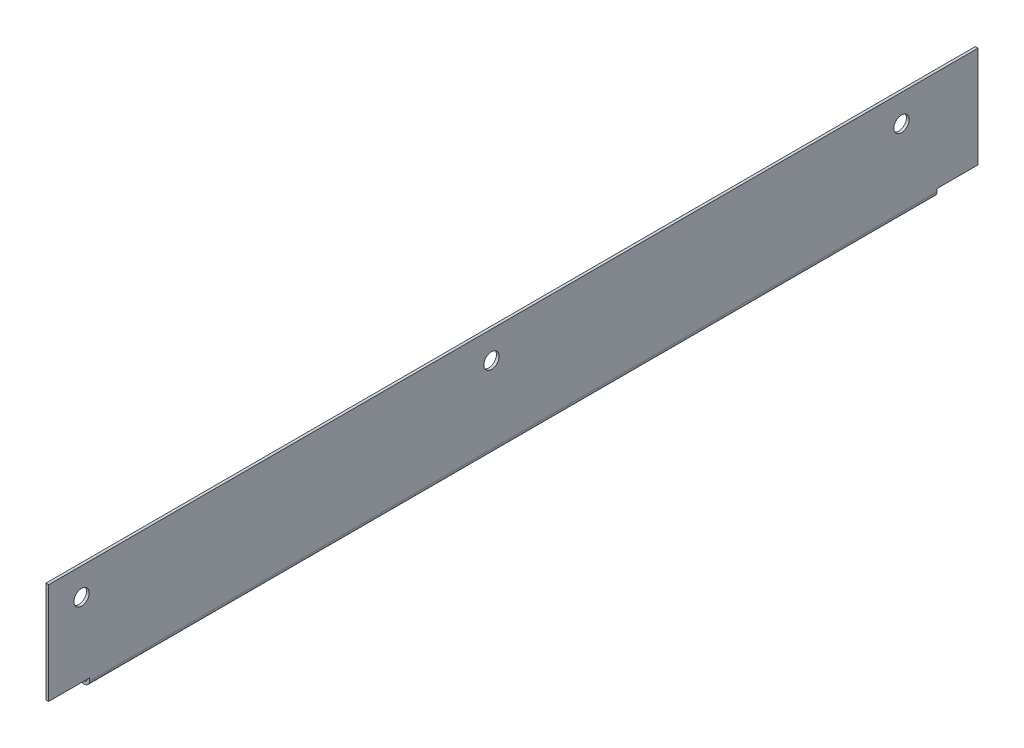
ISO-10303-21;
HEADER;
FILE_DESCRIPTION(('STEP AP214'),'2;1');
FILE_NAME('part.step','',(''),(''),'','','');
FILE_SCHEMA(('AUTOMOTIVE_DESIGN { 1 0 10303 214 1 1 1 1 }'));
ENDSEC;
DATA;
#1=APPLICATION_CONTEXT('core data for automotive mechanical design processes');
#2=APPLICATION_PROTOCOL_DEFINITION('international standard','automotive_design',2000,#1);
#3=PRODUCT_CONTEXT('',#1,'mechanical');
#4=PRODUCT('Part','Part','',(#3));
#5=PRODUCT_RELATED_PRODUCT_CATEGORY('part','',(#4));
#6=PRODUCT_DEFINITION_FORMATION('','',#4);
#7=PRODUCT_DEFINITION_CONTEXT('part definition',#1,'design');
#8=PRODUCT_DEFINITION('design','',#6,#7);
#9=PRODUCT_DEFINITION_SHAPE('','',#8);
#10=(LENGTH_UNIT() NAMED_UNIT(*) SI_UNIT(.MILLI.,.METRE.));
#11=(NAMED_UNIT(*) PLANE_ANGLE_UNIT() SI_UNIT($,.RADIAN.));
#12=(NAMED_UNIT(*) SI_UNIT($,.STERADIAN.) SOLID_ANGLE_UNIT());
#13=UNCERTAINTY_MEASURE_WITH_UNIT(LENGTH_MEASURE(1.E-05),#10,'distance_accuracy_value','');
#14=(GEOMETRIC_REPRESENTATION_CONTEXT(3) GLOBAL_UNCERTAINTY_ASSIGNED_CONTEXT((#13)) GLOBAL_UNIT_ASSIGNED_CONTEXT((#10,
#11,#12)) REPRESENTATION_CONTEXT('',''));
#15=CARTESIAN_POINT('',(0.,0.,0.));
#16=DIRECTION('',(0.,0.,1.));
#17=DIRECTION('',(1.,0.,0.));
#18=AXIS2_PLACEMENT_3D('',#15,#16,#17);
#19=CARTESIAN_POINT('',(-2.,2.,0.));
#20=DIRECTION('',(0.,0.,-1.));
#21=DIRECTION('',(-1.,0.,0.));
#22=AXIS2_PLACEMENT_3D('',#19,#20,#21);
#23=PLANE('',#22);
#24=DIRECTION('',(-1.,0.,0.));
#25=VECTOR('',#24,1.);
#26=CARTESIAN_POINT('',(-2.,3.,0.));
#27=LINE('',#26,#25);
#28=CARTESIAN_POINT('',(0.,3.,0.));
#29=VERTEX_POINT('',#28);
#30=CARTESIAN_POINT('',(-1.,3.,0.));
#31=VERTEX_POINT('',#30);
#32=EDGE_CURVE('E39',#29,#31,#27,.T.);
#33=ORIENTED_EDGE('',*,*,#32,.F.);
#34=DIRECTION('',(0.,1.,0.));
#35=VECTOR('',#34,1.);
#36=CARTESIAN_POINT('',(0.,2.00000000000001,0.));
#37=LINE('',#36,#35);
#38=CARTESIAN_POINT('',(0.,40.,0.));
#39=VERTEX_POINT('',#38);
#40=EDGE_CURVE('E244',#29,#39,#37,.T.);
#41=ORIENTED_EDGE('',*,*,#40,.T.);
#42=DIRECTION('',(-1.,0.,0.));
#43=VECTOR('',#42,1.);
#44=CARTESIAN_POINT('',(-1.,40.,0.));
#45=LINE('',#44,#43);
#46=CARTESIAN_POINT('',(-1.,40.,0.));
#47=VERTEX_POINT('',#46);
#48=EDGE_CURVE('E249',#39,#47,#45,.T.);
#49=ORIENTED_EDGE('',*,*,#48,.T.);
#50=DIRECTION('',(0.,-1.,0.));
#51=VECTOR('',#50,1.);
#52=CARTESIAN_POINT('',(-1.,2.00000000000001,0.));
#53=LINE('',#52,#51);
#54=EDGE_CURVE('E163',#47,#31,#53,.T.);
#55=ORIENTED_EDGE('',*,*,#54,.T.);
#56=EDGE_LOOP('',(#33,#41,#49,#55));
#57=FACE_BOUND('',#56,.T.);
#58=ADVANCED_FACE('F31',(#57),#23,.F.);
#59=CARTESIAN_POINT('',(-15.,1.,-340.));
#60=DIRECTION('',(-1.,0.,0.));
#61=DIRECTION('',(0.,0.,1.));
#62=AXIS2_PLACEMENT_3D('',#59,#60,#61);
#63=PLANE('',#62);
#64=DIRECTION('',(0.,-1.,0.));
#65=VECTOR('',#64,1.);
#66=CARTESIAN_POINT('',(-15.,3.,-325.));
#67=LINE('',#66,#65);
#68=CARTESIAN_POINT('',(-15.,1.,-325.));
#69=VERTEX_POINT('',#68);
#70=CARTESIAN_POINT('',(-15.,0.,-325.));
#71=VERTEX_POINT('',#70);
#72=EDGE_CURVE('E123',#69,#71,#67,.T.);
#73=ORIENTED_EDGE('',*,*,#72,.T.);
#74=DIRECTION('',(0.,0.,1.));
#75=VECTOR('',#74,1.);
#76=CARTESIAN_POINT('',(-15.,0.,-340.));
#77=LINE('',#76,#75);
#78=CARTESIAN_POINT('',(-15.,0.,-15.));
#79=VERTEX_POINT('',#78);
#80=EDGE_CURVE('E135',#71,#79,#77,.T.);
#81=ORIENTED_EDGE('',*,*,#80,.T.);
#82=DIRECTION('',(0.,-1.,0.));
#83=VECTOR('',#82,1.);
#84=CARTESIAN_POINT('',(-15.,1.,-15.));
#85=LINE('',#84,#83);
#86=CARTESIAN_POINT('',(-15.,1.,-15.));
#87=VERTEX_POINT('',#86);
#88=EDGE_CURVE('E200',#87,#79,#85,.T.);
#89=ORIENTED_EDGE('',*,*,#88,.F.);
#90=DIRECTION('',(0.,0.,1.));
#91=VECTOR('',#90,1.);
#92=CARTESIAN_POINT('',(-15.,1.,-340.));
#93=LINE('',#92,#91);
#94=EDGE_CURVE('E137',#69,#87,#93,.T.);
#95=ORIENTED_EDGE('',*,*,#94,.F.);
#96=EDGE_LOOP('',(#73,#81,#89,#95));
#97=FACE_BOUND('',#96,.T.);
#98=ADVANCED_FACE('F33',(#97),#63,.T.);
#99=CARTESIAN_POINT('',(-2.00000000000001,1.,-340.));
#100=DIRECTION('',(0.,1.,0.));
#101=DIRECTION('',(0.,0.,1.));
#102=AXIS2_PLACEMENT_3D('',#99,#100,#101);
#103=PLANE('',#102);
#104=DIRECTION('',(1.,0.,0.));
#105=VECTOR('',#104,1.);
#106=CARTESIAN_POINT('',(-2.00000000000001,1.,-325.));
#107=LINE('',#106,#105);
#108=CARTESIAN_POINT('',(-2.00000000000001,1.,-325.));
#109=VERTEX_POINT('',#108);
#110=EDGE_CURVE('E265',#69,#109,#107,.T.);
#111=ORIENTED_EDGE('',*,*,#110,.F.);
#112=ORIENTED_EDGE('',*,*,#94,.T.);
#113=DIRECTION('',(-1.,0.,0.));
#114=VECTOR('',#113,1.);
#115=CARTESIAN_POINT('',(-2.00000000000001,1.,-15.));
#116=LINE('',#115,#114);
#117=CARTESIAN_POINT('',(-2.00000000000001,1.,-15.));
#118=VERTEX_POINT('',#117);
#119=EDGE_CURVE('E198',#118,#87,#116,.T.);
#120=ORIENTED_EDGE('',*,*,#119,.F.);
#121=DIRECTION('',(0.,0.,1.));
#122=VECTOR('',#121,1.);
#123=CARTESIAN_POINT('',(-2.00000000000001,1.,-340.));
#124=LINE('',#123,#122);
#125=EDGE_CURVE('E155',#109,#118,#124,.T.);
#126=ORIENTED_EDGE('',*,*,#125,.F.);
#127=EDGE_LOOP('',(#111,#112,#120,#126));
#128=FACE_BOUND('',#127,.T.);
#129=CARTESIAN_POINT('',(-9.,1.,-30.));
#130=DIRECTION('',(0.,1.,0.));
#131=DIRECTION('',(0.,0.,1.));
#132=AXIS2_PLACEMENT_3D('',#129,#130,#131);
#133=CIRCLE('',#132,2.15000000000001);
#134=CARTESIAN_POINT('',(-9.,1.,-27.85));
#135=VERTEX_POINT('',#134);
#136=EDGE_CURVE('E205',#135,#135,#133,.T.);
#137=ORIENTED_EDGE('',*,*,#136,.F.);
#138=EDGE_LOOP('',(#137));
#139=FACE_BOUND('',#138,.T.);
#140=CARTESIAN_POINT('',(-9.,1.,-100.));
#141=DIRECTION('',(0.,1.,0.));
#142=DIRECTION('',(0.,0.,1.));
#143=AXIS2_PLACEMENT_3D('',#140,#141,#142);
#144=CIRCLE('',#143,2.15000000000001);
#145=CARTESIAN_POINT('',(-9.,1.,-97.85));
#146=VERTEX_POINT('',#145);
#147=EDGE_CURVE('E211',#146,#146,#144,.T.);
#148=ORIENTED_EDGE('',*,*,#147,.F.);
#149=EDGE_LOOP('',(#148));
#150=FACE_BOUND('',#149,.T.);
#151=CARTESIAN_POINT('',(-9.,1.,-170.));
#152=DIRECTION('',(0.,1.,0.));
#153=DIRECTION('',(0.,0.,1.));
#154=AXIS2_PLACEMENT_3D('',#151,#152,#153);
#155=CIRCLE('',#154,2.15000000000001);
#156=CARTESIAN_POINT('',(-9.,1.,-167.85));
#157=VERTEX_POINT('',#156);
#158=EDGE_CURVE('E217',#157,#157,#155,.T.);
#159=ORIENTED_EDGE('',*,*,#158,.F.);
#160=EDGE_LOOP('',(#159));
#161=FACE_BOUND('',#160,.T.);
#162=CARTESIAN_POINT('',(-9.,1.,-240.));
#163=DIRECTION('',(0.,1.,0.));
#164=DIRECTION('',(0.,0.,1.));
#165=AXIS2_PLACEMENT_3D('',#162,#163,#164);
#166=CIRCLE('',#165,2.15000000000001);
#167=CARTESIAN_POINT('',(-9.,1.,-237.85));
#168=VERTEX_POINT('',#167);
#169=EDGE_CURVE('E223',#168,#168,#166,.T.);
#170=ORIENTED_EDGE('',*,*,#169,.F.);
#171=EDGE_LOOP('',(#170));
#172=FACE_BOUND('',#171,.T.);
#173=ADVANCED_FACE('F302',(#128,#139,#150,#161,#172),#103,.T.);
#174=CARTESIAN_POINT('',(-2.,2.,-340.));
#175=DIRECTION('',(0.,0.,1.));
#176=DIRECTION('',(1.,0.,0.));
#177=AXIS2_PLACEMENT_3D('',#174,#175,#176);
#178=CYLINDRICAL_SURFACE('',#177,1.);
#179=CARTESIAN_POINT('',(-2.,2.,-325.));
#180=DIRECTION('',(0.,0.,1.));
#181=DIRECTION('',(1.,0.,0.));
#182=AXIS2_PLACEMENT_3D('',#179,#180,#181);
#183=CIRCLE('',#182,1.);
#184=CARTESIAN_POINT('',(-1.,2.00000000000001,-325.));
#185=VERTEX_POINT('',#184);
#186=EDGE_CURVE('E268',#109,#185,#183,.T.);
#187=ORIENTED_EDGE('',*,*,#186,.F.);
#188=ORIENTED_EDGE('',*,*,#125,.T.);
#189=CARTESIAN_POINT('',(-2.,2.,-15.));
#190=DIRECTION('',(0.,0.,-1.));
#191=DIRECTION('',(-1.,0.,0.));
#192=AXIS2_PLACEMENT_3D('',#189,#190,#191);
#193=CIRCLE('',#192,1.);
#194=CARTESIAN_POINT('',(-1.,2.00000000000001,-15.));
#195=VERTEX_POINT('',#194);
#196=EDGE_CURVE('E192',#195,#118,#193,.T.);
#197=ORIENTED_EDGE('',*,*,#196,.F.);
#198=DIRECTION('',(0.,0.,1.));
#199=VECTOR('',#198,1.);
#200=CARTESIAN_POINT('',(-1.,2.00000000000001,-340.));
#201=LINE('',#200,#199);
#202=EDGE_CURVE('E160',#185,#195,#201,.T.);
#203=ORIENTED_EDGE('',*,*,#202,.F.);
#204=EDGE_LOOP('',(#187,#188,#197,#203));
#205=FACE_BOUND('',#204,.T.);
#206=ADVANCED_FACE('F295',(#205),#178,.F.);
#207=CARTESIAN_POINT('',(-1.,2.00000000000001,-340.));
#208=DIRECTION('',(-1.,0.,0.));
#209=DIRECTION('',(0.,0.,1.));
#210=AXIS2_PLACEMENT_3D('',#207,#208,#209);
#211=PLANE('',#210);
#212=DIRECTION('',(0.,1.,0.));
#213=VECTOR('',#212,1.);
#214=CARTESIAN_POINT('',(-1.,2.00000000000001,-325.));
#215=LINE('',#214,#213);
#216=CARTESIAN_POINT('',(-1.,3.,-325.));
#217=VERTEX_POINT('',#216);
#218=EDGE_CURVE('E270',#185,#217,#215,.T.);
#219=ORIENTED_EDGE('',*,*,#218,.F.);
#220=ORIENTED_EDGE('',*,*,#202,.T.);
#221=DIRECTION('',(0.,-1.,0.));
#222=VECTOR('',#221,1.);
#223=CARTESIAN_POINT('',(-1.,2.00000000000001,-15.));
#224=LINE('',#223,#222);
#225=CARTESIAN_POINT('',(-1.,3.,-15.));
#226=VERTEX_POINT('',#225);
#227=EDGE_CURVE('E189',#226,#195,#224,.T.);
#228=ORIENTED_EDGE('',*,*,#227,.F.);
#229=DIRECTION('',(0.,0.,1.));
#230=VECTOR('',#229,1.);
#231=CARTESIAN_POINT('',(-1.,3.,-340.));
#232=LINE('',#231,#230);
#233=EDGE_CURVE('E184',#226,#31,#232,.T.);
#234=ORIENTED_EDGE('',*,*,#233,.T.);
#235=ORIENTED_EDGE('',*,*,#54,.F.);
#236=DIRECTION('',(0.,0.,1.));
#237=VECTOR('',#236,1.);
#238=CARTESIAN_POINT('',(-1.,40.,-340.));
#239=LINE('',#238,#237);
#240=CARTESIAN_POINT('',(-1.,40.,-340.));
#241=VERTEX_POINT('',#240);
#242=EDGE_CURVE('E167',#241,#47,#239,.T.);
#243=ORIENTED_EDGE('',*,*,#242,.F.);
#244=DIRECTION('',(0.,-1.,0.));
#245=VECTOR('',#244,1.);
#246=CARTESIAN_POINT('',(-1.,2.00000000000001,-340.));
#247=LINE('',#246,#245);
#248=CARTESIAN_POINT('',(-1.,3.,-340.));
#249=VERTEX_POINT('',#248);
#250=EDGE_CURVE('E146',#241,#249,#247,.T.);
#251=ORIENTED_EDGE('',*,*,#250,.T.);
#252=DIRECTION('',(0.,0.,-1.));
#253=VECTOR('',#252,1.);
#254=CARTESIAN_POINT('',(-1.,3.,-340.));
#255=LINE('',#254,#253);
#256=EDGE_CURVE('E45',#217,#249,#255,.T.);
#257=ORIENTED_EDGE('',*,*,#256,.F.);
#258=EDGE_LOOP('',(#219,#220,#228,#234,#235,#243,#251,#257));
#259=FACE_BOUND('',#258,.T.);
#260=CARTESIAN_POINT('',(-1.,30.,-312.));
#261=DIRECTION('',(-1.,0.,0.));
#262=DIRECTION('',(0.,0.,1.));
#263=AXIS2_PLACEMENT_3D('',#260,#261,#262);
#264=CIRCLE('',#263,2.80000000000001);
#265=CARTESIAN_POINT('',(-1.,30.,-309.2));
#266=VERTEX_POINT('',#265);
#267=EDGE_CURVE('E229',#266,#266,#264,.T.);
#268=ORIENTED_EDGE('',*,*,#267,.F.);
#269=EDGE_LOOP('',(#268));
#270=FACE_BOUND('',#269,.T.);
#271=CARTESIAN_POINT('',(-1.,30.,-162.));
#272=DIRECTION('',(-1.,0.,0.));
#273=DIRECTION('',(0.,0.,1.));
#274=AXIS2_PLACEMENT_3D('',#271,#272,#273);
#275=CIRCLE('',#274,2.80000000000001);
#276=CARTESIAN_POINT('',(-1.,30.,-159.2));
#277=VERTEX_POINT('',#276);
#278=EDGE_CURVE('E235',#277,#277,#275,.T.);
#279=ORIENTED_EDGE('',*,*,#278,.F.);
#280=EDGE_LOOP('',(#279));
#281=FACE_BOUND('',#280,.T.);
#282=CARTESIAN_POINT('',(-1.,30.,-12.));
#283=DIRECTION('',(-1.,0.,0.));
#284=DIRECTION('',(0.,0.,1.));
#285=AXIS2_PLACEMENT_3D('',#282,#283,#284);
#286=CIRCLE('',#285,2.8);
#287=CARTESIAN_POINT('',(-1.,30.,-9.20000000000001));
#288=VERTEX_POINT('',#287);
#289=EDGE_CURVE('E241',#288,#288,#286,.T.);
#290=ORIENTED_EDGE('',*,*,#289,.F.);
#291=EDGE_LOOP('',(#290));
#292=FACE_BOUND('',#291,.T.);
#293=ADVANCED_FACE('F257',(#259,#270,#281,#292),#211,.T.);
#294=CARTESIAN_POINT('',(-1.,40.,-340.));
#295=DIRECTION('',(0.,1.,0.));
#296=DIRECTION('',(0.,0.,1.));
#297=AXIS2_PLACEMENT_3D('',#294,#295,#296);
#298=PLANE('',#297);
#299=ORIENTED_EDGE('',*,*,#48,.F.);
#300=DIRECTION('',(0.,0.,1.));
#301=VECTOR('',#300,1.);
#302=CARTESIAN_POINT('',(0.,40.,-340.));
#303=LINE('',#302,#301);
#304=CARTESIAN_POINT('',(0.,40.,-340.));
#305=VERTEX_POINT('',#304);
#306=EDGE_CURVE('E169',#305,#39,#303,.T.);
#307=ORIENTED_EDGE('',*,*,#306,.F.);
#308=DIRECTION('',(-1.,0.,0.));
#309=VECTOR('',#308,1.);
#310=CARTESIAN_POINT('',(-1.,40.,-340.));
#311=LINE('',#310,#309);
#312=EDGE_CURVE('E151',#305,#241,#311,.T.);
#313=ORIENTED_EDGE('',*,*,#312,.T.);
#314=ORIENTED_EDGE('',*,*,#242,.T.);
#315=EDGE_LOOP('',(#299,#307,#313,#314));
#316=FACE_BOUND('',#315,.T.);
#317=ADVANCED_FACE('F287',(#316),#298,.T.);
#318=CARTESIAN_POINT('',(0.,2.00000000000001,-340.));
#319=DIRECTION('',(1.,0.,0.));
#320=DIRECTION('',(0.,0.,-1.));
#321=AXIS2_PLACEMENT_3D('',#318,#319,#320);
#322=PLANE('',#321);
#323=DIRECTION('',(0.,-1.,0.));
#324=VECTOR('',#323,1.);
#325=CARTESIAN_POINT('',(0.,2.00000000000001,-325.));
#326=LINE('',#325,#324);
#327=CARTESIAN_POINT('',(0.,3.,-325.));
#328=VERTEX_POINT('',#327);
#329=CARTESIAN_POINT('',(0.,2.,-325.));
#330=VERTEX_POINT('',#329);
#331=EDGE_CURVE('E272',#328,#330,#326,.T.);
#332=ORIENTED_EDGE('',*,*,#331,.F.);
#333=DIRECTION('',(0.,0.,1.));
#334=VECTOR('',#333,1.);
#335=CARTESIAN_POINT('',(0.,3.,-340.));
#336=LINE('',#335,#334);
#337=CARTESIAN_POINT('',(0.,3.,-340.));
#338=VERTEX_POINT('',#337);
#339=EDGE_CURVE('E138',#338,#328,#336,.T.);
#340=ORIENTED_EDGE('',*,*,#339,.F.);
#341=DIRECTION('',(0.,1.,0.));
#342=VECTOR('',#341,1.);
#343=CARTESIAN_POINT('',(0.,2.00000000000001,-340.));
#344=LINE('',#343,#342);
#345=EDGE_CURVE('E245',#338,#305,#344,.T.);
#346=ORIENTED_EDGE('',*,*,#345,.T.);
#347=ORIENTED_EDGE('',*,*,#306,.T.);
#348=ORIENTED_EDGE('',*,*,#40,.F.);
#349=DIRECTION('',(0.,0.,-1.));
#350=VECTOR('',#349,1.);
#351=CARTESIAN_POINT('',(0.,3.,-340.));
#352=LINE('',#351,#350);
#353=CARTESIAN_POINT('',(0.,3.,-15.));
#354=VERTEX_POINT('',#353);
#355=EDGE_CURVE('E53',#29,#354,#352,.T.);
#356=ORIENTED_EDGE('',*,*,#355,.T.);
#357=DIRECTION('',(0.,1.,0.));
#358=VECTOR('',#357,1.);
#359=CARTESIAN_POINT('',(0.,2.00000000000001,-15.));
#360=LINE('',#359,#358);
#361=CARTESIAN_POINT('',(0.,2.00000000000001,-15.));
#362=VERTEX_POINT('',#361);
#363=EDGE_CURVE('E183',#362,#354,#360,.T.);
#364=ORIENTED_EDGE('',*,*,#363,.F.);
#365=DIRECTION('',(0.,0.,1.));
#366=VECTOR('',#365,1.);
#367=CARTESIAN_POINT('',(0.,2.00000000000001,-340.));
#368=LINE('',#367,#366);
#369=EDGE_CURVE('E148',#330,#362,#368,.T.);
#370=ORIENTED_EDGE('',*,*,#369,.F.);
#371=EDGE_LOOP('',(#332,#340,#346,#347,#348,#356,#364,#370));
#372=FACE_BOUND('',#371,.T.);
#373=CARTESIAN_POINT('',(0.,30.,-312.));
#374=DIRECTION('',(1.,0.,0.));
#375=DIRECTION('',(0.,0.,-1.));
#376=AXIS2_PLACEMENT_3D('',#373,#374,#375);
#377=CIRCLE('',#376,2.80000000000001);
#378=CARTESIAN_POINT('',(0.,30.,-314.8));
#379=VERTEX_POINT('',#378);
#380=EDGE_CURVE('E226',#379,#379,#377,.T.);
#381=ORIENTED_EDGE('',*,*,#380,.F.);
#382=EDGE_LOOP('',(#381));
#383=FACE_BOUND('',#382,.T.);
#384=CARTESIAN_POINT('',(0.,30.,-162.));
#385=DIRECTION('',(1.,0.,0.));
#386=DIRECTION('',(0.,0.,-1.));
#387=AXIS2_PLACEMENT_3D('',#384,#385,#386);
#388=CIRCLE('',#387,2.80000000000001);
#389=CARTESIAN_POINT('',(0.,30.,-164.8));
#390=VERTEX_POINT('',#389);
#391=EDGE_CURVE('E232',#390,#390,#388,.T.);
#392=ORIENTED_EDGE('',*,*,#391,.F.);
#393=EDGE_LOOP('',(#392));
#394=FACE_BOUND('',#393,.T.);
#395=CARTESIAN_POINT('',(0.,30.,-12.));
#396=DIRECTION('',(1.,0.,0.));
#397=DIRECTION('',(0.,0.,-1.));
#398=AXIS2_PLACEMENT_3D('',#395,#396,#397);
#399=CIRCLE('',#398,2.8);
#400=CARTESIAN_POINT('',(0.,30.,-14.8));
#401=VERTEX_POINT('',#400);
#402=EDGE_CURVE('E238',#401,#401,#399,.T.);
#403=ORIENTED_EDGE('',*,*,#402,.F.);
#404=EDGE_LOOP('',(#403));
#405=FACE_BOUND('',#404,.T.);
#406=ADVANCED_FACE('F186',(#372,#383,#394,#405),#322,.T.);
#407=CARTESIAN_POINT('',(-2.,2.,-340.));
#408=DIRECTION('',(0.,0.,1.));
#409=DIRECTION('',(1.,0.,0.));
#410=AXIS2_PLACEMENT_3D('',#407,#408,#409);
#411=CYLINDRICAL_SURFACE('',#410,2.);
#412=CARTESIAN_POINT('',(-2.,2.,-325.));
#413=DIRECTION('',(0.,0.,1.));
#414=DIRECTION('',(1.,0.,0.));
#415=AXIS2_PLACEMENT_3D('',#412,#413,#414);
#416=CIRCLE('',#415,2.);
#417=CARTESIAN_POINT('',(-2.00000000000001,0.,-325.));
#418=VERTEX_POINT('',#417);
#419=EDGE_CURVE('E126',#330,#418,#416,.F.);
#420=ORIENTED_EDGE('',*,*,#419,.F.);
#421=ORIENTED_EDGE('',*,*,#369,.T.);
#422=CARTESIAN_POINT('',(-2.,2.,-15.));
#423=DIRECTION('',(0.,0.,-1.));
#424=DIRECTION('',(-1.,0.,0.));
#425=AXIS2_PLACEMENT_3D('',#422,#423,#424);
#426=CIRCLE('',#425,2.);
#427=CARTESIAN_POINT('',(-2.00000000000001,0.,-15.));
#428=VERTEX_POINT('',#427);
#429=EDGE_CURVE('E176',#428,#362,#426,.F.);
#430=ORIENTED_EDGE('',*,*,#429,.F.);
#431=DIRECTION('',(0.,0.,1.));
#432=VECTOR('',#431,1.);
#433=CARTESIAN_POINT('',(-2.00000000000001,0.,-340.));
#434=LINE('',#433,#432);
#435=EDGE_CURVE('E145',#418,#428,#434,.T.);
#436=ORIENTED_EDGE('',*,*,#435,.F.);
#437=EDGE_LOOP('',(#420,#421,#430,#436));
#438=FACE_BOUND('',#437,.T.);
#439=ADVANCED_FACE('F175',(#438),#411,.T.);
#440=CARTESIAN_POINT('',(-2.00000000000001,0.,-340.));
#441=DIRECTION('',(0.,-1.,0.));
#442=DIRECTION('',(1.,0.,0.));
#443=AXIS2_PLACEMENT_3D('',#440,#441,#442);
#444=PLANE('',#443);
#445=DIRECTION('',(-1.,0.,0.));
#446=VECTOR('',#445,1.);
#447=CARTESIAN_POINT('',(-15.,0.,-325.));
#448=LINE('',#447,#446);
#449=EDGE_CURVE('E120',#418,#71,#448,.T.);
#450=ORIENTED_EDGE('',*,*,#449,.F.);
#451=ORIENTED_EDGE('',*,*,#435,.T.);
#452=DIRECTION('',(1.,0.,0.));
#453=VECTOR('',#452,1.);
#454=CARTESIAN_POINT('',(-17.2737898080727,0.,-15.));
#455=LINE('',#454,#453);
#456=EDGE_CURVE('E144',#79,#428,#455,.T.);
#457=ORIENTED_EDGE('',*,*,#456,.F.);
#458=ORIENTED_EDGE('',*,*,#80,.F.);
#459=EDGE_LOOP('',(#450,#451,#457,#458));
#460=FACE_BOUND('',#459,.T.);
#461=CARTESIAN_POINT('',(-9.,0.,-30.));
#462=DIRECTION('',(0.,-1.,0.));
#463=DIRECTION('',(1.,0.,0.));
#464=AXIS2_PLACEMENT_3D('',#461,#462,#463);
#465=CIRCLE('',#464,2.15000000000001);
#466=CARTESIAN_POINT('',(-6.84999999999999,0.,-30.));
#467=VERTEX_POINT('',#466);
#468=EDGE_CURVE('E202',#467,#467,#465,.T.);
#469=ORIENTED_EDGE('',*,*,#468,.F.);
#470=EDGE_LOOP('',(#469));
#471=FACE_BOUND('',#470,.T.);
#472=CARTESIAN_POINT('',(-9.,0.,-100.));
#473=DIRECTION('',(0.,-1.,0.));
#474=DIRECTION('',(1.,0.,0.));
#475=AXIS2_PLACEMENT_3D('',#472,#473,#474);
#476=CIRCLE('',#475,2.15000000000001);
#477=CARTESIAN_POINT('',(-6.84999999999999,0.,-100.));
#478=VERTEX_POINT('',#477);
#479=EDGE_CURVE('E208',#478,#478,#476,.T.);
#480=ORIENTED_EDGE('',*,*,#479,.F.);
#481=EDGE_LOOP('',(#480));
#482=FACE_BOUND('',#481,.T.);
#483=CARTESIAN_POINT('',(-9.,0.,-170.));
#484=DIRECTION('',(0.,-1.,0.));
#485=DIRECTION('',(1.,0.,0.));
#486=AXIS2_PLACEMENT_3D('',#483,#484,#485);
#487=CIRCLE('',#486,2.15000000000001);
#488=CARTESIAN_POINT('',(-6.84999999999999,0.,-170.));
#489=VERTEX_POINT('',#488);
#490=EDGE_CURVE('E214',#489,#489,#487,.T.);
#491=ORIENTED_EDGE('',*,*,#490,.F.);
#492=EDGE_LOOP('',(#491));
#493=FACE_BOUND('',#492,.T.);
#494=CARTESIAN_POINT('',(-9.,0.,-240.));
#495=DIRECTION('',(0.,-1.,0.));
#496=DIRECTION('',(1.,0.,0.));
#497=AXIS2_PLACEMENT_3D('',#494,#495,#496);
#498=CIRCLE('',#497,2.15000000000001);
#499=CARTESIAN_POINT('',(-6.84999999999999,0.,-240.));
#500=VERTEX_POINT('',#499);
#501=EDGE_CURVE('E220',#500,#500,#498,.T.);
#502=ORIENTED_EDGE('',*,*,#501,.F.);
#503=EDGE_LOOP('',(#502));
#504=FACE_BOUND('',#503,.T.);
#505=ADVANCED_FACE('F141',(#460,#471,#482,#493,#504),#444,.T.);
#506=CARTESIAN_POINT('',(-2.,2.,-340.));
#507=DIRECTION('',(0.,0.,-1.));
#508=DIRECTION('',(-1.,0.,0.));
#509=AXIS2_PLACEMENT_3D('',#506,#507,#508);
#510=PLANE('',#509);
#511=DIRECTION('',(1.,0.,0.));
#512=VECTOR('',#511,1.);
#513=CARTESIAN_POINT('',(-2.,3.,-340.));
#514=LINE('',#513,#512);
#515=EDGE_CURVE('E11',#249,#338,#514,.T.);
#516=ORIENTED_EDGE('',*,*,#515,.F.);
#517=ORIENTED_EDGE('',*,*,#250,.F.);
#518=ORIENTED_EDGE('',*,*,#312,.F.);
#519=ORIENTED_EDGE('',*,*,#345,.F.);
#520=EDGE_LOOP('',(#516,#517,#518,#519));
#521=FACE_BOUND('',#520,.T.);
#522=ADVANCED_FACE('F283',(#521),#510,.T.);
#523=CARTESIAN_POINT('',(-340.,30.,-12.));
#524=DIRECTION('',(1.,0.,0.));
#525=DIRECTION('',(0.,0.,-1.));
#526=AXIS2_PLACEMENT_3D('',#523,#524,#525);
#527=CYLINDRICAL_SURFACE('',#526,2.8);
#528=ORIENTED_EDGE('',*,*,#289,.T.);
#529=EDGE_LOOP('',(#528));
#530=FACE_BOUND('',#529,.T.);
#531=ORIENTED_EDGE('',*,*,#402,.T.);
#532=EDGE_LOOP('',(#531));
#533=FACE_BOUND('',#532,.T.);
#534=ADVANCED_FACE('F349',(#530,#533),#527,.F.);
#535=CARTESIAN_POINT('',(-340.,30.,-162.));
#536=DIRECTION('',(1.,0.,0.));
#537=DIRECTION('',(0.,0.,-1.));
#538=AXIS2_PLACEMENT_3D('',#535,#536,#537);
#539=CYLINDRICAL_SURFACE('',#538,2.80000000000001);
#540=ORIENTED_EDGE('',*,*,#278,.T.);
#541=EDGE_LOOP('',(#540));
#542=FACE_BOUND('',#541,.T.);
#543=ORIENTED_EDGE('',*,*,#391,.T.);
#544=EDGE_LOOP('',(#543));
#545=FACE_BOUND('',#544,.T.);
#546=ADVANCED_FACE('F346',(#542,#545),#539,.F.);
#547=CARTESIAN_POINT('',(-340.,30.,-312.));
#548=DIRECTION('',(1.,0.,0.));
#549=DIRECTION('',(0.,0.,-1.));
#550=AXIS2_PLACEMENT_3D('',#547,#548,#549);
#551=CYLINDRICAL_SURFACE('',#550,2.80000000000001);
#552=ORIENTED_EDGE('',*,*,#267,.T.);
#553=EDGE_LOOP('',(#552));
#554=FACE_BOUND('',#553,.T.);
#555=ORIENTED_EDGE('',*,*,#380,.T.);
#556=EDGE_LOOP('',(#555));
#557=FACE_BOUND('',#556,.T.);
#558=ADVANCED_FACE('F342',(#554,#557),#551,.F.);
#559=CARTESIAN_POINT('',(-9.00000000000004,340.,-240.));
#560=DIRECTION('',(0.,-1.,0.));
#561=DIRECTION('',(1.,0.,0.));
#562=AXIS2_PLACEMENT_3D('',#559,#560,#561);
#563=CYLINDRICAL_SURFACE('',#562,2.15000000000001);
#564=ORIENTED_EDGE('',*,*,#169,.T.);
#565=EDGE_LOOP('',(#564));
#566=FACE_BOUND('',#565,.T.);
#567=ORIENTED_EDGE('',*,*,#501,.T.);
#568=EDGE_LOOP('',(#567));
#569=FACE_BOUND('',#568,.T.);
#570=ADVANCED_FACE('F338',(#566,#569),#563,.F.);
#571=CARTESIAN_POINT('',(-9.00000000000004,340.,-170.));
#572=DIRECTION('',(0.,-1.,0.));
#573=DIRECTION('',(1.,0.,0.));
#574=AXIS2_PLACEMENT_3D('',#571,#572,#573);
#575=CYLINDRICAL_SURFACE('',#574,2.15000000000001);
#576=ORIENTED_EDGE('',*,*,#158,.T.);
#577=EDGE_LOOP('',(#576));
#578=FACE_BOUND('',#577,.T.);
#579=ORIENTED_EDGE('',*,*,#490,.T.);
#580=EDGE_LOOP('',(#579));
#581=FACE_BOUND('',#580,.T.);
#582=ADVANCED_FACE('F334',(#578,#581),#575,.F.);
#583=CARTESIAN_POINT('',(-9.00000000000004,340.,-100.));
#584=DIRECTION('',(0.,-1.,0.));
#585=DIRECTION('',(1.,0.,0.));
#586=AXIS2_PLACEMENT_3D('',#583,#584,#585);
#587=CYLINDRICAL_SURFACE('',#586,2.15000000000001);
#588=ORIENTED_EDGE('',*,*,#147,.T.);
#589=EDGE_LOOP('',(#588));
#590=FACE_BOUND('',#589,.T.);
#591=ORIENTED_EDGE('',*,*,#479,.T.);
#592=EDGE_LOOP('',(#591));
#593=FACE_BOUND('',#592,.T.);
#594=ADVANCED_FACE('F330',(#590,#593),#587,.F.);
#595=CARTESIAN_POINT('',(-9.00000000000004,340.,-30.));
#596=DIRECTION('',(0.,-1.,0.));
#597=DIRECTION('',(1.,0.,0.));
#598=AXIS2_PLACEMENT_3D('',#595,#596,#597);
#599=CYLINDRICAL_SURFACE('',#598,2.15000000000001);
#600=ORIENTED_EDGE('',*,*,#136,.T.);
#601=EDGE_LOOP('',(#600));
#602=FACE_BOUND('',#601,.T.);
#603=ORIENTED_EDGE('',*,*,#468,.T.);
#604=EDGE_LOOP('',(#603));
#605=FACE_BOUND('',#604,.T.);
#606=ADVANCED_FACE('F324',(#602,#605),#599,.F.);
#607=CARTESIAN_POINT('',(-17.2737898080727,3.,-15.));
#608=DIRECTION('',(0.,0.,-1.));
#609=DIRECTION('',(-1.,0.,0.));
#610=AXIS2_PLACEMENT_3D('',#607,#608,#609);
#611=PLANE('',#610);
#612=ORIENTED_EDGE('',*,*,#88,.T.);
#613=ORIENTED_EDGE('',*,*,#456,.T.);
#614=ORIENTED_EDGE('',*,*,#429,.T.);
#615=ORIENTED_EDGE('',*,*,#363,.T.);
#616=DIRECTION('',(1.,0.,0.));
#617=VECTOR('',#616,1.);
#618=CARTESIAN_POINT('',(-17.2737898080727,3.,-15.));
#619=LINE('',#618,#617);
#620=EDGE_CURVE('E261',#226,#354,#619,.T.);
#621=ORIENTED_EDGE('',*,*,#620,.F.);
#622=ORIENTED_EDGE('',*,*,#227,.T.);
#623=ORIENTED_EDGE('',*,*,#196,.T.);
#624=ORIENTED_EDGE('',*,*,#119,.T.);
#625=EDGE_LOOP('',(#612,#613,#614,#615,#621,#622,#623,#624));
#626=FACE_BOUND('',#625,.T.);
#627=ADVANCED_FACE('F181',(#626),#611,.F.);
#628=CARTESIAN_POINT('',(-17.2737898080727,3.,-15.));
#629=DIRECTION('',(0.,-1.,0.));
#630=DIRECTION('',(1.,0.,0.));
#631=AXIS2_PLACEMENT_3D('',#628,#629,#630);
#632=PLANE('',#631);
#633=ORIENTED_EDGE('',*,*,#620,.T.);
#634=ORIENTED_EDGE('',*,*,#355,.F.);
#635=ORIENTED_EDGE('',*,*,#32,.T.);
#636=ORIENTED_EDGE('',*,*,#233,.F.);
#637=EDGE_LOOP('',(#633,#634,#635,#636));
#638=FACE_BOUND('',#637,.T.);
#639=ADVANCED_FACE('F316',(#638),#632,.T.);
#640=CARTESIAN_POINT('',(-15.,3.,-325.));
#641=DIRECTION('',(0.,0.,1.));
#642=DIRECTION('',(1.,0.,0.));
#643=AXIS2_PLACEMENT_3D('',#640,#641,#642);
#644=PLANE('',#643);
#645=ORIENTED_EDGE('',*,*,#110,.T.);
#646=ORIENTED_EDGE('',*,*,#186,.T.);
#647=ORIENTED_EDGE('',*,*,#218,.T.);
#648=DIRECTION('',(-1.,0.,0.));
#649=VECTOR('',#648,1.);
#650=CARTESIAN_POINT('',(-15.,3.,-325.));
#651=LINE('',#650,#649);
#652=EDGE_CURVE('E130',#328,#217,#651,.T.);
#653=ORIENTED_EDGE('',*,*,#652,.F.);
#654=ORIENTED_EDGE('',*,*,#331,.T.);
#655=ORIENTED_EDGE('',*,*,#419,.T.);
#656=ORIENTED_EDGE('',*,*,#449,.T.);
#657=ORIENTED_EDGE('',*,*,#72,.F.);
#658=EDGE_LOOP('',(#645,#646,#647,#653,#654,#655,#656,#657));
#659=FACE_BOUND('',#658,.T.);
#660=ADVANCED_FACE('F122',(#659),#644,.F.);
#661=CARTESIAN_POINT('',(-15.,3.,-325.));
#662=DIRECTION('',(0.,1.,0.));
#663=DIRECTION('',(-1.,0.,0.));
#664=AXIS2_PLACEMENT_3D('',#661,#662,#663);
#665=PLANE('',#664);
#666=ORIENTED_EDGE('',*,*,#256,.T.);
#667=ORIENTED_EDGE('',*,*,#515,.T.);
#668=ORIENTED_EDGE('',*,*,#339,.T.);
#669=ORIENTED_EDGE('',*,*,#652,.T.);
#670=EDGE_LOOP('',(#666,#667,#668,#669));
#671=FACE_BOUND('',#670,.T.);
#672=ADVANCED_FACE('F278',(#671),#665,.F.);
#673=CLOSED_SHELL('',(#58,#98,#173,#206,#293,#317,#406,#439,#505,#522,#534,#546,#558,#570,#582,
#594,#606,#627,#639,#660,#672));
#674=MANIFOLD_SOLID_BREP('B2',#673);
#675=ADVANCED_BREP_SHAPE_REPRESENTATION('',(#18,#674),#14);
#676=SHAPE_DEFINITION_REPRESENTATION(#9,#675);
ENDSEC;
END-ISO-10303-21;
